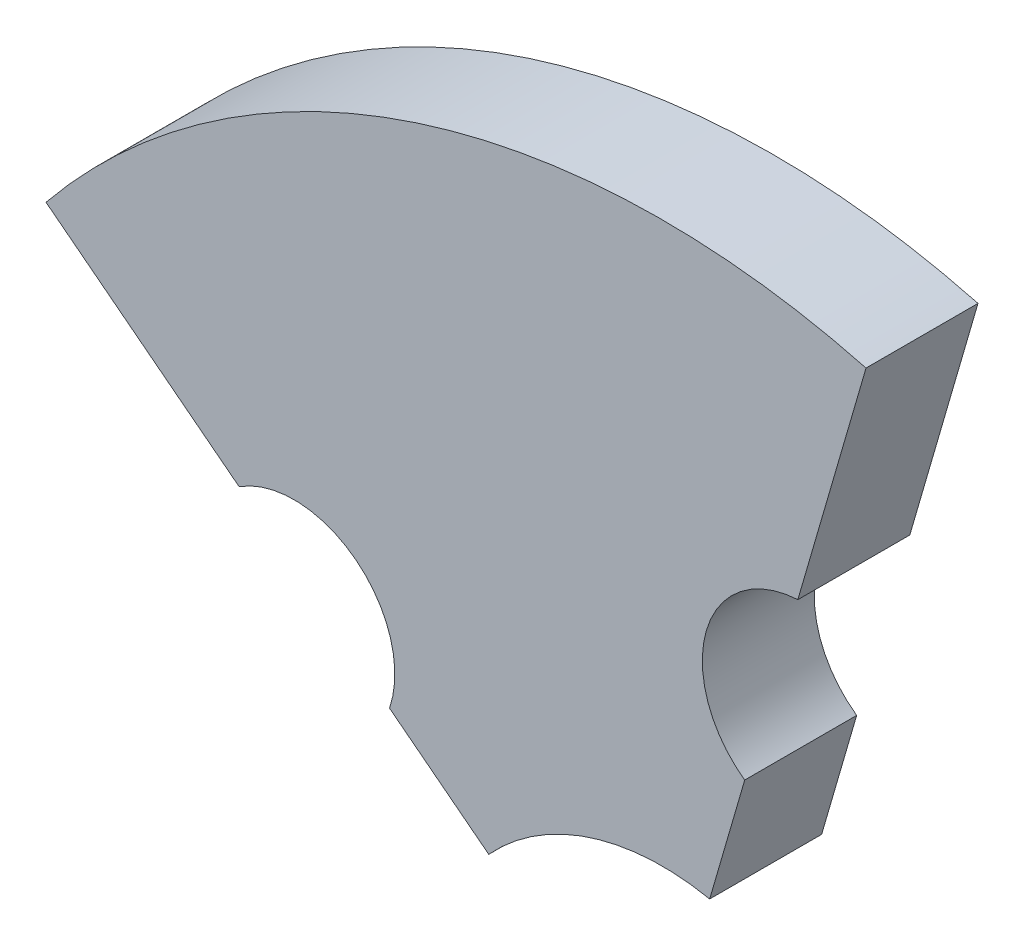
ISO-10303-21;
HEADER;
FILE_DESCRIPTION(('STEP AP214'),'2;1');
FILE_NAME('part.step','',(''),(''),'','','');
FILE_SCHEMA(('AUTOMOTIVE_DESIGN { 1 0 10303 214 1 1 1 1 }'));
ENDSEC;
DATA;
#1=APPLICATION_CONTEXT('core data for automotive mechanical design processes');
#2=APPLICATION_PROTOCOL_DEFINITION('international standard','automotive_design',2000,#1);
#3=PRODUCT_CONTEXT('',#1,'mechanical');
#4=PRODUCT('Part','Part','',(#3));
#5=PRODUCT_RELATED_PRODUCT_CATEGORY('part','',(#4));
#6=PRODUCT_DEFINITION_FORMATION('','',#4);
#7=PRODUCT_DEFINITION_CONTEXT('part definition',#1,'design');
#8=PRODUCT_DEFINITION('design','',#6,#7);
#9=PRODUCT_DEFINITION_SHAPE('','',#8);
#10=(LENGTH_UNIT() NAMED_UNIT(*) SI_UNIT(.MILLI.,.METRE.));
#11=(NAMED_UNIT(*) PLANE_ANGLE_UNIT() SI_UNIT($,.RADIAN.));
#12=(NAMED_UNIT(*) SI_UNIT($,.STERADIAN.) SOLID_ANGLE_UNIT());
#13=UNCERTAINTY_MEASURE_WITH_UNIT(LENGTH_MEASURE(1.E-05),#10,'distance_accuracy_value','');
#14=(GEOMETRIC_REPRESENTATION_CONTEXT(3) GLOBAL_UNCERTAINTY_ASSIGNED_CONTEXT((#13)) GLOBAL_UNIT_ASSIGNED_CONTEXT((#10,
#11,#12)) REPRESENTATION_CONTEXT('',''));
#15=CARTESIAN_POINT('',(0.,0.,0.));
#16=DIRECTION('',(0.,0.,1.));
#17=DIRECTION('',(1.,0.,0.));
#18=AXIS2_PLACEMENT_3D('',#15,#16,#17);
#19=CARTESIAN_POINT('',(-1.02733869968574,0.298572552493891,-6.35));
#20=DIRECTION('',(-0.960267870711613,0.279079946393476,0.));
#21=DIRECTION('',(-0.279079946393476,-0.960267870711613,0.));
#22=AXIS2_PLACEMENT_3D('',#19,#20,#21);
#23=PLANE('',#22);
#24=DIRECTION('',(-0.279079946393476,-0.960267870711613,0.));
#25=VECTOR('',#24,1.);
#26=CARTESIAN_POINT('',(-1.02733869968574,0.298572552493891,-6.35));
#27=LINE('',#26,#25);
#28=CARTESIAN_POINT('',(4.66964003784766,19.900932781084,-6.35));
#29=VERTEX_POINT('',#28);
#30=CARTESIAN_POINT('',(2.68219604859296,13.0624672002234,-6.35));
#31=VERTEX_POINT('',#30);
#32=EDGE_CURVE('E121',#29,#31,#27,.T.);
#33=ORIENTED_EDGE('',*,*,#32,.F.);
#34=DIRECTION('',(0.,0.,1.));
#35=VECTOR('',#34,1.);
#36=CARTESIAN_POINT('',(4.66964003784766,19.900932781084,-6.35));
#37=LINE('',#36,#35);
#38=CARTESIAN_POINT('',(4.66964003784766,19.900932781084,0.));
#39=VERTEX_POINT('',#38);
#40=EDGE_CURVE('E107',#29,#39,#37,.T.);
#41=ORIENTED_EDGE('',*,*,#40,.T.);
#42=DIRECTION('',(-0.279079946393476,-0.960267870711613,0.));
#43=VECTOR('',#42,1.);
#44=CARTESIAN_POINT('',(-1.02733869968574,0.298572552493891,0.));
#45=LINE('',#44,#43);
#46=CARTESIAN_POINT('',(2.68219604859296,13.0624672002234,0.));
#47=VERTEX_POINT('',#46);
#48=EDGE_CURVE('E158',#39,#47,#45,.T.);
#49=ORIENTED_EDGE('',*,*,#48,.T.);
#50=DIRECTION('',(0.,0.,1.));
#51=VECTOR('',#50,1.);
#52=CARTESIAN_POINT('',(2.68219604859296,13.0624672002234,-6.35));
#53=LINE('',#52,#51);
#54=EDGE_CURVE('E11',#31,#47,#53,.T.);
#55=ORIENTED_EDGE('',*,*,#54,.F.);
#56=EDGE_LOOP('',(#33,#41,#49,#55));
#57=FACE_BOUND('',#56,.T.);
#58=ADVANCED_FACE('F41',(#57),#23,.F.);
#59=CARTESIAN_POINT('',(0.655637923929589,0.845404805806061,-6.35));
#60=DIRECTION('',(-0.61283394985728,-0.790211712076153,0.));
#61=DIRECTION('',(0.790211712076153,-0.61283394985728,0.));
#62=AXIS2_PLACEMENT_3D('',#59,#60,#61);
#63=PLANE('',#62);
#64=DIRECTION('',(0.,0.,1.));
#65=VECTOR('',#64,1.);
#66=CARTESIAN_POINT('',(-15.4752929438175,13.3554472760491,-6.35));
#67=LINE('',#66,#65);
#68=CARTESIAN_POINT('',(-15.4752929438175,13.3554472760491,-6.35));
#69=VERTEX_POINT('',#68);
#70=CARTESIAN_POINT('',(-15.4752929438175,13.3554472760491,0.));
#71=VERTEX_POINT('',#70);
#72=EDGE_CURVE('E59',#69,#71,#67,.T.);
#73=ORIENTED_EDGE('',*,*,#72,.F.);
#74=DIRECTION('',(0.790211712076153,-0.61283394985728,0.));
#75=VECTOR('',#74,1.);
#76=CARTESIAN_POINT('',(0.655637923929589,0.845404805806061,-6.35));
#77=LINE('',#76,#75);
#78=CARTESIAN_POINT('',(-9.84786776440252,8.99120267232597,-6.35));
#79=VERTEX_POINT('',#78);
#80=EDGE_CURVE('E145',#69,#79,#77,.T.);
#81=ORIENTED_EDGE('',*,*,#80,.T.);
#82=DIRECTION('',(0.,0.,1.));
#83=VECTOR('',#82,1.);
#84=CARTESIAN_POINT('',(-9.84786776440252,8.99120267232597,-6.35));
#85=LINE('',#84,#83);
#86=CARTESIAN_POINT('',(-9.84786776440252,8.99120267232597,0.));
#87=VERTEX_POINT('',#86);
#88=EDGE_CURVE('E51',#79,#87,#85,.T.);
#89=ORIENTED_EDGE('',*,*,#88,.T.);
#90=DIRECTION('',(0.790211712076153,-0.61283394985728,0.));
#91=VECTOR('',#90,1.);
#92=CARTESIAN_POINT('',(0.655637923929589,0.845404805806061,0.));
#93=LINE('',#92,#91);
#94=EDGE_CURVE('E162',#71,#87,#93,.T.);
#95=ORIENTED_EDGE('',*,*,#94,.F.);
#96=EDGE_LOOP('',(#73,#81,#89,#95));
#97=FACE_BOUND('',#96,.T.);
#98=ADVANCED_FACE('F189',(#97),#63,.T.);
#99=CARTESIAN_POINT('',(11.5514376911436,43.5800586537883,0.));
#100=VERTEX_POINT('',#99);
#101=CARTESIAN_POINT('',(7.68226165110816,30.2668647629782,0.));
#102=VERTEX_POINT('',#101);
#103=EDGE_CURVE('E153',#100,#102,#45,.T.);
#104=ORIENTED_EDGE('',*,*,#103,.T.);
#105=DIRECTION('',(0.,0.,1.));
#106=VECTOR('',#105,1.);
#107=CARTESIAN_POINT('',(7.68226165110816,30.2668647629782,-6.35));
#108=LINE('',#107,#106);
#109=CARTESIAN_POINT('',(7.68226165110816,30.2668647629782,-6.35));
#110=VERTEX_POINT('',#109);
#111=EDGE_CURVE('E67',#110,#102,#108,.T.);
#112=ORIENTED_EDGE('',*,*,#111,.F.);
#113=CARTESIAN_POINT('',(11.5514376911436,43.5800586537883,-6.35));
#114=VERTEX_POINT('',#113);
#115=EDGE_CURVE('E125',#114,#110,#27,.T.);
#116=ORIENTED_EDGE('',*,*,#115,.F.);
#117=DIRECTION('',(0.,0.,1.));
#118=VECTOR('',#117,1.);
#119=CARTESIAN_POINT('',(11.5514376911436,43.5800586537883,-6.35));
#120=LINE('',#119,#118);
#121=EDGE_CURVE('E45',#114,#100,#120,.T.);
#122=ORIENTED_EDGE('',*,*,#121,.T.);
#123=EDGE_LOOP('',(#104,#112,#116,#122));
#124=FACE_BOUND('',#123,.T.);
#125=ADVANCED_FACE('F43',(#124),#23,.F.);
#126=CARTESIAN_POINT('',(0.,0.,-6.35));
#127=DIRECTION('',(0.,0.,1.));
#128=DIRECTION('',(1.,0.,0.));
#129=AXIS2_PLACEMENT_3D('',#126,#127,#128);
#130=CYLINDRICAL_SURFACE('',#129,13.335);
#131=CARTESIAN_POINT('',(0.,0.,0.));
#132=DIRECTION('',(0.,0.,1.));
#133=DIRECTION('',(1.,0.,0.));
#134=AXIS2_PLACEMENT_3D('',#131,#132,#133);
#135=CIRCLE('',#134,13.335);
#136=EDGE_CURVE('E130',#47,#87,#135,.T.);
#137=ORIENTED_EDGE('',*,*,#136,.T.);
#138=ORIENTED_EDGE('',*,*,#88,.F.);
#139=CARTESIAN_POINT('',(0.,0.,-6.35));
#140=DIRECTION('',(0.,0.,1.));
#141=DIRECTION('',(1.,0.,0.));
#142=AXIS2_PLACEMENT_3D('',#139,#140,#141);
#143=CIRCLE('',#142,13.335);
#144=EDGE_CURVE('E150',#31,#79,#143,.T.);
#145=ORIENTED_EDGE('',*,*,#144,.F.);
#146=ORIENTED_EDGE('',*,*,#54,.T.);
#147=EDGE_LOOP('',(#137,#138,#145,#146));
#148=FACE_BOUND('',#147,.T.);
#149=ADVANCED_FACE('F186',(#148),#130,.F.);
#150=DIRECTION('',(0.,0.,1.));
#151=VECTOR('',#150,1.);
#152=CARTESIAN_POINT('',(-24.0054969717908,19.9708878569242,-6.35));
#153=LINE('',#152,#151);
#154=CARTESIAN_POINT('',(-24.0054969717908,19.9708878569242,-6.35));
#155=VERTEX_POINT('',#154);
#156=CARTESIAN_POINT('',(-24.0054969717908,19.9708878569242,0.));
#157=VERTEX_POINT('',#156);
#158=EDGE_CURVE('E140',#155,#157,#153,.T.);
#159=ORIENTED_EDGE('',*,*,#158,.T.);
#160=CARTESIAN_POINT('',(-34.9610251723362,28.467243349142,0.));
#161=VERTEX_POINT('',#160);
#162=EDGE_CURVE('E136',#161,#157,#93,.T.);
#163=ORIENTED_EDGE('',*,*,#162,.F.);
#164=DIRECTION('',(0.,0.,1.));
#165=VECTOR('',#164,1.);
#166=CARTESIAN_POINT('',(-34.9610251723362,28.467243349142,-6.35));
#167=LINE('',#166,#165);
#168=CARTESIAN_POINT('',(-34.9610251723362,28.467243349142,-6.35));
#169=VERTEX_POINT('',#168);
#170=EDGE_CURVE('E168',#169,#161,#167,.T.);
#171=ORIENTED_EDGE('',*,*,#170,.F.);
#172=EDGE_CURVE('E146',#169,#155,#77,.T.);
#173=ORIENTED_EDGE('',*,*,#172,.T.);
#174=EDGE_LOOP('',(#159,#163,#171,#173));
#175=FACE_BOUND('',#174,.T.);
#176=ADVANCED_FACE('F180',(#175),#63,.T.);
#177=CARTESIAN_POINT('',(0.,0.,-6.35));
#178=DIRECTION('',(0.,0.,1.));
#179=DIRECTION('',(1.,0.,0.));
#180=AXIS2_PLACEMENT_3D('',#177,#178,#179);
#181=CYLINDRICAL_SURFACE('',#180,45.085);
#182=CARTESIAN_POINT('',(0.,0.,0.));
#183=DIRECTION('',(0.,0.,1.));
#184=DIRECTION('',(1.,0.,0.));
#185=AXIS2_PLACEMENT_3D('',#182,#183,#184);
#186=CIRCLE('',#185,45.085);
#187=EDGE_CURVE('E157',#100,#161,#186,.T.);
#188=ORIENTED_EDGE('',*,*,#187,.F.);
#189=ORIENTED_EDGE('',*,*,#121,.F.);
#190=CARTESIAN_POINT('',(0.,0.,-6.35));
#191=DIRECTION('',(0.,0.,1.));
#192=DIRECTION('',(1.,0.,0.));
#193=AXIS2_PLACEMENT_3D('',#190,#191,#192);
#194=CIRCLE('',#193,45.085);
#195=EDGE_CURVE('E134',#114,#169,#194,.T.);
#196=ORIENTED_EDGE('',*,*,#195,.T.);
#197=ORIENTED_EDGE('',*,*,#170,.T.);
#198=EDGE_LOOP('',(#188,#189,#196,#197));
#199=FACE_BOUND('',#198,.T.);
#200=ADVANCED_FACE('F178',(#199),#181,.T.);
#201=CARTESIAN_POINT('',(0.,0.,-6.35));
#202=DIRECTION('',(0.,0.,1.));
#203=DIRECTION('',(1.,0.,0.));
#204=AXIS2_PLACEMENT_3D('',#201,#202,#203);
#205=PLANE('',#204);
#206=ORIENTED_EDGE('',*,*,#115,.T.);
#207=CARTESIAN_POINT('',(7.97990452808567,24.5596207943201,-6.35));
#208=DIRECTION('',(0.,0.,1.));
#209=DIRECTION('',(1.,0.,0.));
#210=AXIS2_PLACEMENT_3D('',#207,#208,#209);
#211=CIRCLE('',#210,5.715);
#212=EDGE_CURVE('E110',#110,#29,#211,.T.);
#213=ORIENTED_EDGE('',*,*,#212,.T.);
#214=ORIENTED_EDGE('',*,*,#32,.T.);
#215=ORIENTED_EDGE('',*,*,#144,.T.);
#216=ORIENTED_EDGE('',*,*,#80,.F.);
#217=CARTESIAN_POINT('',(-20.8916612815078,15.1786804016986,-6.35));
#218=DIRECTION('',(0.,0.,1.));
#219=DIRECTION('',(-1.,0.,0.));
#220=AXIS2_PLACEMENT_3D('',#217,#218,#219);
#221=CIRCLE('',#220,5.715);
#222=EDGE_CURVE('E267',#69,#155,#221,.T.);
#223=ORIENTED_EDGE('',*,*,#222,.T.);
#224=ORIENTED_EDGE('',*,*,#172,.F.);
#225=ORIENTED_EDGE('',*,*,#195,.F.);
#226=EDGE_LOOP('',(#206,#213,#214,#215,#216,#223,#224,#225));
#227=FACE_BOUND('',#226,.T.);
#228=ADVANCED_FACE('F119',(#227),#205,.F.);
#229=CARTESIAN_POINT('',(0.,0.,0.));
#230=DIRECTION('',(0.,0.,1.));
#231=DIRECTION('',(1.,0.,0.));
#232=AXIS2_PLACEMENT_3D('',#229,#230,#231);
#233=PLANE('',#232);
#234=CARTESIAN_POINT('',(7.97990452808567,24.5596207943201,0.));
#235=DIRECTION('',(0.,0.,1.));
#236=DIRECTION('',(1.,0.,0.));
#237=AXIS2_PLACEMENT_3D('',#234,#235,#236);
#238=CIRCLE('',#237,5.715);
#239=EDGE_CURVE('E111',#102,#39,#238,.T.);
#240=ORIENTED_EDGE('',*,*,#239,.F.);
#241=ORIENTED_EDGE('',*,*,#103,.F.);
#242=ORIENTED_EDGE('',*,*,#187,.T.);
#243=ORIENTED_EDGE('',*,*,#162,.T.);
#244=CARTESIAN_POINT('',(-20.8916612815078,15.1786804016986,0.));
#245=DIRECTION('',(0.,0.,1.));
#246=DIRECTION('',(-1.,0.,0.));
#247=AXIS2_PLACEMENT_3D('',#244,#245,#246);
#248=CIRCLE('',#247,5.715);
#249=EDGE_CURVE('E262',#71,#157,#248,.T.);
#250=ORIENTED_EDGE('',*,*,#249,.F.);
#251=ORIENTED_EDGE('',*,*,#94,.T.);
#252=ORIENTED_EDGE('',*,*,#136,.F.);
#253=ORIENTED_EDGE('',*,*,#48,.F.);
#254=EDGE_LOOP('',(#240,#241,#242,#243,#250,#251,#252,#253));
#255=FACE_BOUND('',#254,.T.);
#256=ADVANCED_FACE('F177',(#255),#233,.T.);
#257=CARTESIAN_POINT('',(-20.8916612815078,15.1786804016986,-6.35));
#258=DIRECTION('',(0.,0.,1.));
#259=DIRECTION('',(1.,0.,0.));
#260=AXIS2_PLACEMENT_3D('',#257,#258,#259);
#261=CYLINDRICAL_SURFACE('',#260,5.715);
#262=ORIENTED_EDGE('',*,*,#249,.T.);
#263=ORIENTED_EDGE('',*,*,#158,.F.);
#264=ORIENTED_EDGE('',*,*,#222,.F.);
#265=ORIENTED_EDGE('',*,*,#72,.T.);
#266=EDGE_LOOP('',(#262,#263,#264,#265));
#267=FACE_BOUND('',#266,.T.);
#268=ADVANCED_FACE('F205',(#267),#261,.F.);
#269=CARTESIAN_POINT('',(7.97990452808567,24.5596207943201,-6.35));
#270=DIRECTION('',(0.,0.,1.));
#271=DIRECTION('',(1.,0.,0.));
#272=AXIS2_PLACEMENT_3D('',#269,#270,#271);
#273=CYLINDRICAL_SURFACE('',#272,5.715);
#274=ORIENTED_EDGE('',*,*,#239,.T.);
#275=ORIENTED_EDGE('',*,*,#40,.F.);
#276=ORIENTED_EDGE('',*,*,#212,.F.);
#277=ORIENTED_EDGE('',*,*,#111,.T.);
#278=EDGE_LOOP('',(#274,#275,#276,#277));
#279=FACE_BOUND('',#278,.T.);
#280=ADVANCED_FACE('F109',(#279),#273,.F.);
#281=CLOSED_SHELL('',(#58,#98,#125,#149,#176,#200,#228,#256,#268,#280));
#282=MANIFOLD_SOLID_BREP('B2',#281);
#283=ADVANCED_BREP_SHAPE_REPRESENTATION('',(#18,#282),#14);
#284=SHAPE_DEFINITION_REPRESENTATION(#9,#283);
ENDSEC;
END-ISO-10303-21;
